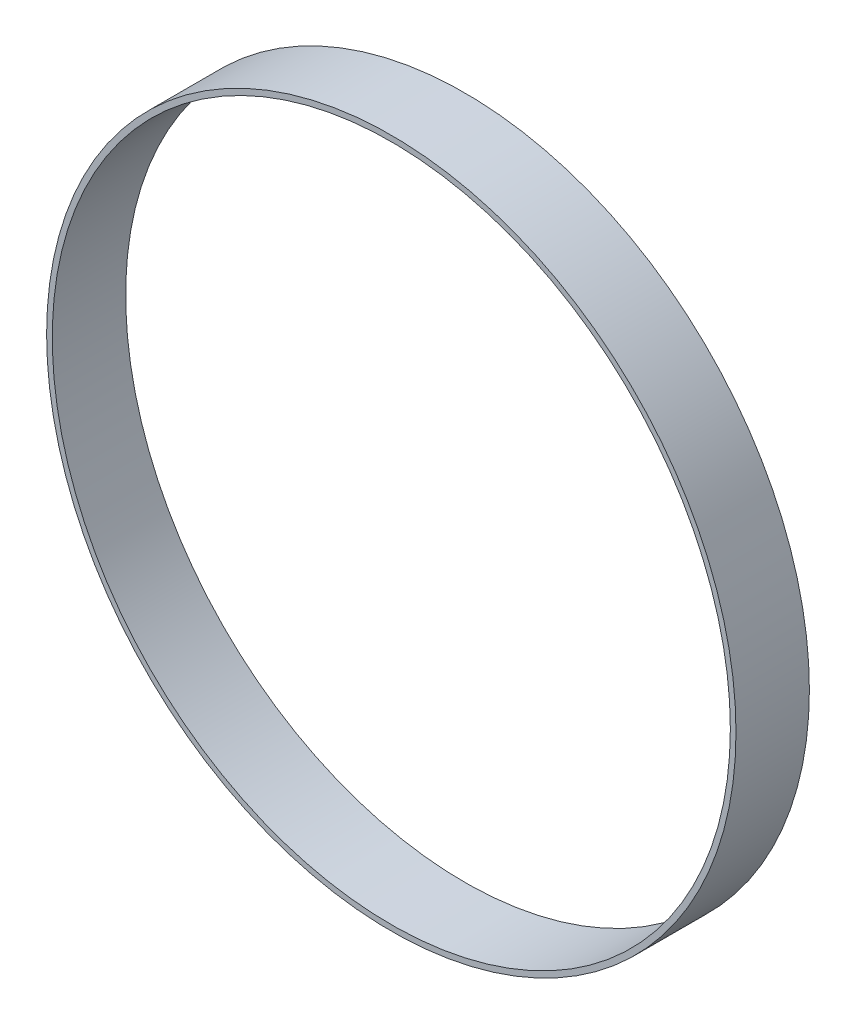
ISO-10303-21;
HEADER;
FILE_DESCRIPTION(('STEP AP214'),'2;1');
FILE_NAME('part.step','',(''),(''),'','','');
FILE_SCHEMA(('AUTOMOTIVE_DESIGN { 1 0 10303 214 1 1 1 1 }'));
ENDSEC;
DATA;
#1=APPLICATION_CONTEXT('core data for automotive mechanical design processes');
#2=APPLICATION_PROTOCOL_DEFINITION('international standard','automotive_design',2000,#1);
#3=PRODUCT_CONTEXT('',#1,'mechanical');
#4=PRODUCT('Part','Part','',(#3));
#5=PRODUCT_RELATED_PRODUCT_CATEGORY('part','',(#4));
#6=PRODUCT_DEFINITION_FORMATION('','',#4);
#7=PRODUCT_DEFINITION_CONTEXT('part definition',#1,'design');
#8=PRODUCT_DEFINITION('design','',#6,#7);
#9=PRODUCT_DEFINITION_SHAPE('','',#8);
#10=(LENGTH_UNIT() NAMED_UNIT(*) SI_UNIT(.MILLI.,.METRE.));
#11=(NAMED_UNIT(*) PLANE_ANGLE_UNIT() SI_UNIT($,.RADIAN.));
#12=(NAMED_UNIT(*) SI_UNIT($,.STERADIAN.) SOLID_ANGLE_UNIT());
#13=UNCERTAINTY_MEASURE_WITH_UNIT(LENGTH_MEASURE(1.E-05),#10,'distance_accuracy_value','');
#14=(GEOMETRIC_REPRESENTATION_CONTEXT(3) GLOBAL_UNCERTAINTY_ASSIGNED_CONTEXT((#13)) GLOBAL_UNIT_ASSIGNED_CONTEXT((#10,
#11,#12)) REPRESENTATION_CONTEXT('',''));
#15=CARTESIAN_POINT('',(0.,0.,0.));
#16=DIRECTION('',(0.,0.,1.));
#17=DIRECTION('',(1.,0.,0.));
#18=AXIS2_PLACEMENT_3D('',#15,#16,#17);
#19=CARTESIAN_POINT('',(0.,0.,165.1));
#20=DIRECTION('',(0.,0.,1.));
#21=DIRECTION('',(1.,0.,0.));
#22=AXIS2_PLACEMENT_3D('',#19,#20,#21);
#23=PLANE('',#22);
#24=CARTESIAN_POINT('',(0.,0.,165.1));
#25=DIRECTION('',(0.,0.,1.));
#26=DIRECTION('',(1.,0.,0.));
#27=AXIS2_PLACEMENT_3D('',#24,#25,#26);
#28=CIRCLE('',#27,775.335);
#29=CARTESIAN_POINT('',(775.335,0.,165.1));
#30=VERTEX_POINT('',#29);
#31=EDGE_CURVE('E10',#30,#30,#28,.T.);
#32=ORIENTED_EDGE('',*,*,#31,.T.);
#33=EDGE_LOOP('',(#32));
#34=FACE_BOUND('',#33,.T.);
#35=CARTESIAN_POINT('',(0.,0.,165.1));
#36=DIRECTION('',(0.,0.,1.));
#37=DIRECTION('',(1.,0.,0.));
#38=AXIS2_PLACEMENT_3D('',#35,#36,#37);
#39=CIRCLE('',#38,762.635);
#40=CARTESIAN_POINT('',(762.635,0.,165.1));
#41=VERTEX_POINT('',#40);
#42=EDGE_CURVE('E50',#41,#41,#39,.T.);
#43=ORIENTED_EDGE('',*,*,#42,.F.);
#44=EDGE_LOOP('',(#43));
#45=FACE_BOUND('',#44,.T.);
#46=ADVANCED_FACE('F37',(#34,#45),#23,.T.);
#47=CARTESIAN_POINT('',(0.,0.,0.));
#48=DIRECTION('',(0.,0.,1.));
#49=DIRECTION('',(1.,0.,0.));
#50=AXIS2_PLACEMENT_3D('',#47,#48,#49);
#51=PLANE('',#50);
#52=CARTESIAN_POINT('',(0.,0.,0.));
#53=DIRECTION('',(0.,0.,1.));
#54=DIRECTION('',(1.,0.,0.));
#55=AXIS2_PLACEMENT_3D('',#52,#53,#54);
#56=CIRCLE('',#55,775.335);
#57=CARTESIAN_POINT('',(775.335,0.,0.));
#58=VERTEX_POINT('',#57);
#59=EDGE_CURVE('E41',#58,#58,#56,.T.);
#60=ORIENTED_EDGE('',*,*,#59,.F.);
#61=EDGE_LOOP('',(#60));
#62=FACE_BOUND('',#61,.T.);
#63=CARTESIAN_POINT('',(0.,0.,0.));
#64=DIRECTION('',(0.,0.,1.));
#65=DIRECTION('',(1.,0.,0.));
#66=AXIS2_PLACEMENT_3D('',#63,#64,#65);
#67=CIRCLE('',#66,762.635);
#68=CARTESIAN_POINT('',(762.635,0.,0.));
#69=VERTEX_POINT('',#68);
#70=EDGE_CURVE('E52',#69,#69,#67,.T.);
#71=ORIENTED_EDGE('',*,*,#70,.T.);
#72=EDGE_LOOP('',(#71));
#73=FACE_BOUND('',#72,.T.);
#74=ADVANCED_FACE('F64',(#62,#73),#51,.F.);
#75=CARTESIAN_POINT('',(0.,0.,165.1));
#76=DIRECTION('',(0.,0.,-1.));
#77=DIRECTION('',(-1.,0.,0.));
#78=AXIS2_PLACEMENT_3D('',#75,#76,#77);
#79=CYLINDRICAL_SURFACE('',#78,775.335);
#80=ORIENTED_EDGE('',*,*,#31,.F.);
#81=EDGE_LOOP('',(#80));
#82=FACE_BOUND('',#81,.T.);
#83=ORIENTED_EDGE('',*,*,#59,.T.);
#84=EDGE_LOOP('',(#83));
#85=FACE_BOUND('',#84,.T.);
#86=ADVANCED_FACE('F39',(#82,#85),#79,.T.);
#87=CARTESIAN_POINT('',(0.,0.,165.1));
#88=DIRECTION('',(0.,0.,-1.));
#89=DIRECTION('',(-1.,0.,0.));
#90=AXIS2_PLACEMENT_3D('',#87,#88,#89);
#91=CYLINDRICAL_SURFACE('',#90,762.635);
#92=ORIENTED_EDGE('',*,*,#42,.T.);
#93=EDGE_LOOP('',(#92));
#94=FACE_BOUND('',#93,.T.);
#95=ORIENTED_EDGE('',*,*,#70,.F.);
#96=EDGE_LOOP('',(#95));
#97=FACE_BOUND('',#96,.T.);
#98=ADVANCED_FACE('F60',(#94,#97),#91,.F.);
#99=CLOSED_SHELL('',(#46,#74,#86,#98));
#100=MANIFOLD_SOLID_BREP('B2',#99);
#101=ADVANCED_BREP_SHAPE_REPRESENTATION('',(#18,#100),#14);
#102=SHAPE_DEFINITION_REPRESENTATION(#9,#101);
ENDSEC;
END-ISO-10303-21;
